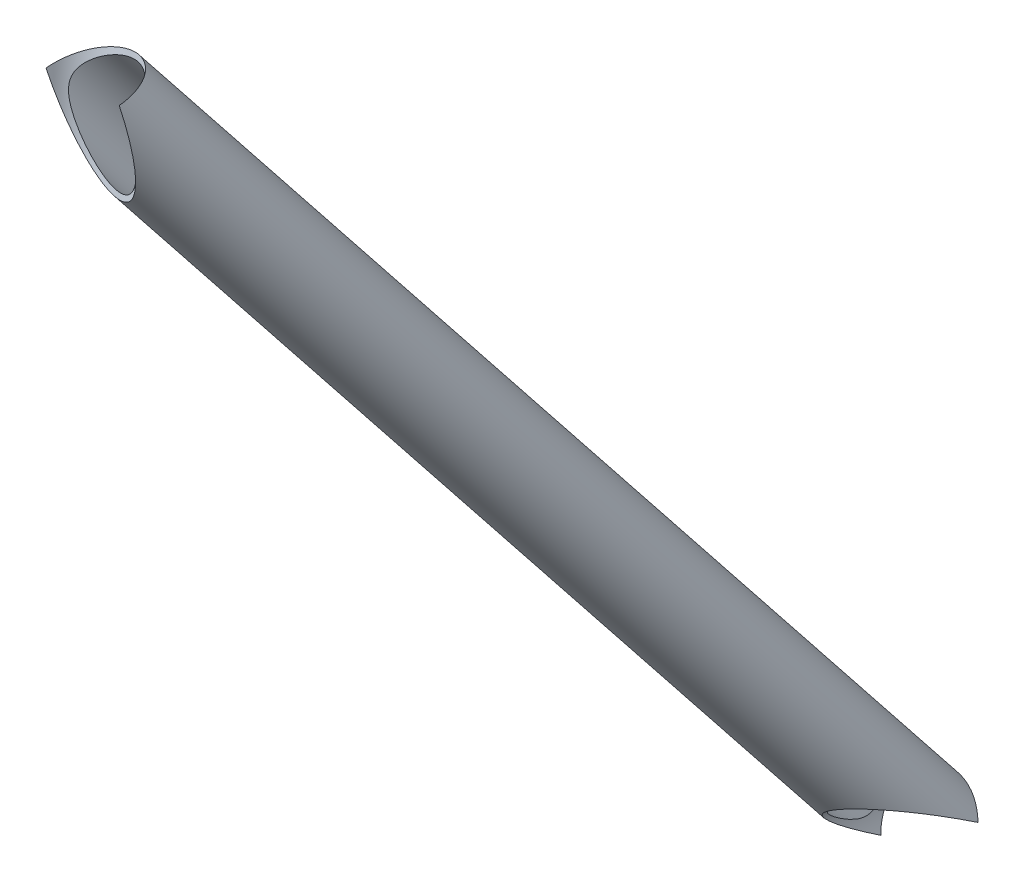
ISO-10303-21;
HEADER;
FILE_DESCRIPTION(('STEP AP214'),'2;1');
FILE_NAME('part.step','',(''),(''),'','','');
FILE_SCHEMA(('AUTOMOTIVE_DESIGN { 1 0 10303 214 1 1 1 1 }'));
ENDSEC;
DATA;
#1=APPLICATION_CONTEXT('core data for automotive mechanical design processes');
#2=APPLICATION_PROTOCOL_DEFINITION('international standard','automotive_design',2000,#1);
#3=PRODUCT_CONTEXT('',#1,'mechanical');
#4=PRODUCT('Part','Part','',(#3));
#5=PRODUCT_RELATED_PRODUCT_CATEGORY('part','',(#4));
#6=PRODUCT_DEFINITION_FORMATION('','',#4);
#7=PRODUCT_DEFINITION_CONTEXT('part definition',#1,'design');
#8=PRODUCT_DEFINITION('design','',#6,#7);
#9=PRODUCT_DEFINITION_SHAPE('','',#8);
#10=(LENGTH_UNIT() NAMED_UNIT(*) SI_UNIT(.MILLI.,.METRE.));
#11=(NAMED_UNIT(*) PLANE_ANGLE_UNIT() SI_UNIT($,.RADIAN.));
#12=(NAMED_UNIT(*) SI_UNIT($,.STERADIAN.) SOLID_ANGLE_UNIT());
#13=UNCERTAINTY_MEASURE_WITH_UNIT(LENGTH_MEASURE(1.E-05),#10,'distance_accuracy_value','');
#14=(GEOMETRIC_REPRESENTATION_CONTEXT(3) GLOBAL_UNCERTAINTY_ASSIGNED_CONTEXT((#13)) GLOBAL_UNIT_ASSIGNED_CONTEXT((#10,
#11,#12)) REPRESENTATION_CONTEXT('',''));
#15=CARTESIAN_POINT('',(0.,0.,0.));
#16=DIRECTION('',(0.,0.,1.));
#17=DIRECTION('',(1.,0.,0.));
#18=AXIS2_PLACEMENT_3D('',#15,#16,#17);
#19=CARTESIAN_POINT('',(250.,220.,-2000.));
#20=DIRECTION('',(-0.220873286514699,0.785327240941153,0.578339101168122));
#21=DIRECTION('',(0.,-0.59298432397081,0.805214003557365));
#22=AXIS2_PLACEMENT_3D('',#19,#20,#21);
#23=CYLINDRICAL_SURFACE('',#22,11.3);
#24=CARTESIAN_POINT('',(188.114990230466,433.334867430807,-1828.86011478433));
#25=CARTESIAN_POINT('',(188.266158284999,433.362322834038,-1828.83989705443));
#26=CARTESIAN_POINT('',(188.415986519138,433.396673524343,-1828.81856938916));
#27=CARTESIAN_POINT('',(188.711693017752,433.478751011434,-1828.77389875648));
#28=CARTESIAN_POINT('',(188.857568542377,433.526486838636,-1828.7505544359));
#29=CARTESIAN_POINT('',(189.144613552529,433.6346880259,-1828.70204815172));
#30=CARTESIAN_POINT('',(189.285770834581,433.695183820761,-1828.67688193856));
#31=CARTESIAN_POINT('',(189.562234221187,433.827810863912,-1828.62505215387));
#32=CARTESIAN_POINT('',(189.697538752933,433.899945215495,-1828.59838818422));
#33=CARTESIAN_POINT('',(189.993469256867,434.07325312663,-1828.5372899054));
#34=CARTESIAN_POINT('',(190.15238200611,434.177241604263,-1828.5025261569));
#35=CARTESIAN_POINT('',(190.459903592466,434.398996733595,-1828.43160413926));
#36=CARTESIAN_POINT('',(190.608509236657,434.516767624699,-1828.39544544334));
#37=CARTESIAN_POINT('',(191.039118766752,434.887704602835,-1828.28543394651));
#38=CARTESIAN_POINT('',(191.305769174728,435.158405670555,-1828.21007661456));
#39=CARTESIAN_POINT('',(191.753085611262,435.676387141786,-1828.07260753032));
#40=CARTESIAN_POINT('',(191.9404279892,435.918171229451,-1828.01073332015));
#41=CARTESIAN_POINT('',(192.293049719159,436.417476584247,-1827.88676270425));
#42=CARTESIAN_POINT('',(192.458314239333,436.675008262935,-1827.82466617762));
#43=CARTESIAN_POINT('',(192.769338491408,437.202095083379,-1827.7007523574));
#44=CARTESIAN_POINT('',(192.915066801935,437.471668686315,-1827.63893566456));
#45=CARTESIAN_POINT('',(193.189084500118,438.019767677615,-1827.51601798561));
#46=CARTESIAN_POINT('',(193.317367226983,438.29829643519,-1827.45491728096));
#47=CARTESIAN_POINT('',(193.557609913149,438.860304048931,-1827.33412122416));
#48=CARTESIAN_POINT('',(193.669671722041,439.143738274181,-1827.27441927024));
#49=CARTESIAN_POINT('',(193.880100711088,439.715819017629,-1827.15621886159));
#50=CARTESIAN_POINT('',(193.978469641741,440.004464864234,-1827.09772025384));
#51=CARTESIAN_POINT('',(194.163002151362,440.586197247886,-1826.98203610973));
#52=CARTESIAN_POINT('',(194.249153480119,440.879287920302,-1826.92485193877));
#53=CARTESIAN_POINT('',(194.410300784775,441.468805908798,-1826.81202163234));
#54=CARTESIAN_POINT('',(194.485296461398,441.765233314164,-1826.75637553815));
#55=CARTESIAN_POINT('',(194.625359135797,442.361840265714,-1826.6465994375));
#56=CARTESIAN_POINT('',(194.690389860291,442.662029409063,-1826.59247552929));
#57=CARTESIAN_POINT('',(194.811044072504,443.264646612775,-1826.4861372898));
#58=CARTESIAN_POINT('',(194.866666765471,443.567074860038,-1826.43392312013));
#59=CARTESIAN_POINT('',(194.969176491384,444.173565384906,-1826.33166123565));
#60=CARTESIAN_POINT('',(195.016068997837,444.477626514872,-1826.2816121786));
#61=CARTESIAN_POINT('',(195.101764918753,445.087271216278,-1826.18390663451));
#62=CARTESIAN_POINT('',(195.140568137605,445.392854824351,-1826.13625020535));
#63=CARTESIAN_POINT('',(195.215927234925,446.051896779727,-1826.03660165069));
#64=CARTESIAN_POINT('',(195.251242630084,446.405564254795,-1825.98505327307));
#65=CARTESIAN_POINT('',(195.312475938377,447.114303750611,-1825.8861660279));
#66=CARTESIAN_POINT('',(195.338393592493,447.469375809799,-1825.83882727639));
#67=CARTESIAN_POINT('',(195.381389079718,448.181039510916,-1825.749118066));
#68=CARTESIAN_POINT('',(195.398458143116,448.537632308572,-1825.70675256808));
#69=CARTESIAN_POINT('',(195.424145491876,449.251781900443,-1825.6281157396));
#70=CARTESIAN_POINT('',(195.432764128585,449.609338653959,-1825.59184415572));
#71=CARTESIAN_POINT('',(195.441846814269,450.323623105991,-1825.52699381989));
#72=CARTESIAN_POINT('',(195.442347733199,450.680347190883,-1825.49838086659));
#73=CARTESIAN_POINT('',(195.43547510621,451.394436401975,-1825.45060933891));
#74=CARTESIAN_POINT('',(195.428100199625,451.751801628292,-1825.43145239902));
#75=CARTESIAN_POINT('',(195.405517018541,452.466179362384,-1825.40542516541));
#76=CARTESIAN_POINT('',(195.390321453177,452.823191503723,-1825.39853501803));
#77=CARTESIAN_POINT('',(195.351909310781,453.536675960561,-1825.40096319875));
#78=CARTESIAN_POINT('',(195.32869643439,453.89314844904,-1825.41027405677));
#79=CARTESIAN_POINT('',(195.28448489296,454.4644675386,-1825.44294977454));
#80=CARTESIAN_POINT('',(195.26620107413,454.679917800347,-1825.45935359124));
#81=CARTESIAN_POINT('',(195.226225123174,455.109583716933,-1825.50205225222));
#82=CARTESIAN_POINT('',(195.20453256092,455.323799212424,-1825.52834834531));
#83=CARTESIAN_POINT('',(195.157441392468,455.749777032377,-1825.59287915041));
#84=CARTESIAN_POINT('',(195.132047479934,455.961542102458,-1825.63109881117));
#85=CARTESIAN_POINT('',(195.077077751804,456.381446524305,-1825.72190962621));
#86=CARTESIAN_POINT('',(195.047503065258,456.589586837974,-1825.77449690396));
#87=CARTESIAN_POINT('',(194.990621307435,456.954864848802,-1825.88310963191));
#88=CARTESIAN_POINT('',(194.964252041835,457.113129219616,-1825.93582043977));
#89=CARTESIAN_POINT('',(194.908274746722,457.424816082627,-1826.05257024331));
#90=CARTESIAN_POINT('',(194.878667834206,457.578240221327,-1826.11660533676));
#91=CARTESIAN_POINT('',(194.815907163116,457.878456241261,-1826.25662023072));
#92=CARTESIAN_POINT('',(194.782760196507,458.025260080737,-1826.33257728473));
#93=CARTESIAN_POINT('',(194.712522265025,458.310906844695,-1826.49669351038));
#94=CARTESIAN_POINT('',(194.675431470302,458.449750112224,-1826.58485215566));
#95=CARTESIAN_POINT('',(194.596817019195,458.718624269109,-1826.77326537604));
#96=CARTESIAN_POINT('',(194.555274166512,458.848612692389,-1826.87357259629));
#97=CARTESIAN_POINT('',(194.467643403193,459.098046687753,-1827.08473803392));
#98=CARTESIAN_POINT('',(194.42155537166,459.217491979238,-1827.19559653196));
#99=CARTESIAN_POINT('',(194.324557134398,459.44560809415,-1827.42638293693));
#100=CARTESIAN_POINT('',(194.273637726451,459.554257515566,-1827.54632805973));
#101=CARTESIAN_POINT('',(194.166911322907,459.760668123867,-1827.79323127348));
#102=CARTESIAN_POINT('',(194.11110263509,459.858425514124,-1827.92019178686));
#103=CARTESIAN_POINT('',(193.97342185674,460.077041268105,-1828.22611246708));
#104=CARTESIAN_POINT('',(193.889421236221,460.193474861269,-1828.40727850725));
#105=CARTESIAN_POINT('',(193.712015323914,460.409128464078,-1828.77514597155));
#106=CARTESIAN_POINT('',(193.618606142923,460.508341308674,-1828.9618496621));
#107=CARTESIAN_POINT('',(193.422065648801,460.691921095197,-1829.33801820676));
#108=CARTESIAN_POINT('',(193.318912643345,460.776253653889,-1829.52748838811));
#109=CARTESIAN_POINT('',(193.103018232593,460.93176820562,-1829.90630174689));
#110=CARTESIAN_POINT('',(192.990276892975,461.002950288724,-1830.09564492518));
#111=CARTESIAN_POINT('',(192.709677672984,461.159183113837,-1830.5451894194));
#112=CARTESIAN_POINT('',(192.537370037351,461.238946330062,-1830.80446642806));
#113=CARTESIAN_POINT('',(192.174373493335,461.379856796961,-1831.3151353866));
#114=CARTESIAN_POINT('',(191.983678889156,461.440998254559,-1831.56652486097));
#115=CARTESIAN_POINT('',(191.584371173578,461.547061832688,-1832.05810876223));
#116=CARTESIAN_POINT('',(191.3757640067,461.591989308491,-1832.29830686263));
#117=CARTESIAN_POINT('',(190.941181568746,461.667396570594,-1832.76485974217));
#118=CARTESIAN_POINT('',(190.715206259303,461.697876324979,-1832.99121449073));
#119=CARTESIAN_POINT('',(190.244949911946,461.745831707872,-1833.42929949903));
#120=CARTESIAN_POINT('',(190.000542916815,461.763206847728,-1833.64090567686));
#121=CARTESIAN_POINT('',(189.496071612413,461.785527187065,-1834.04530295655));
#122=CARTESIAN_POINT('',(189.236006900968,461.790472067131,-1834.23809357481));
#123=CARTESIAN_POINT('',(188.70169334667,461.78866896313,-1834.60270516275));
#124=CARTESIAN_POINT('',(188.427448179246,461.781923994359,-1834.77453152774));
#125=CARTESIAN_POINT('',(187.866388345266,461.757349205233,-1835.09536370855));
#126=CARTESIAN_POINT('',(187.579574051044,461.739519713028,-1835.24437019977));
#127=CARTESIAN_POINT('',(187.000636737213,461.693724218641,-1835.51539448523));
#128=CARTESIAN_POINT('',(186.708705924193,461.66594900609,-1835.637854915));
#129=CARTESIAN_POINT('',(186.116639219319,461.600685490554,-1835.85783442048));
#130=CARTESIAN_POINT('',(185.816503374707,461.563197243482,-1835.95535363977));
#131=CARTESIAN_POINT('',(185.21031655882,461.478967580402,-1836.12439057777));
#132=CARTESIAN_POINT('',(184.904266548333,461.432227656162,-1836.19591248309));
#133=CARTESIAN_POINT('',(184.288587866439,461.329943625276,-1836.31225270849));
#134=CARTESIAN_POINT('',(183.978959323079,461.274399832751,-1836.35707198104));
#135=CARTESIAN_POINT('',(183.373377295727,461.157808298382,-1836.41814638006));
#136=CARTESIAN_POINT('',(183.077475156915,461.097148894405,-1836.43566073774));
#137=CARTESIAN_POINT('',(182.486811455092,460.968637901126,-1836.44611645613));
#138=CARTESIAN_POINT('',(182.192049850856,460.900786574342,-1836.43905871346));
#139=CARTESIAN_POINT('',(181.605825709364,460.758259008751,-1836.40064103755));
#140=CARTESIAN_POINT('',(181.314362755157,460.683583643581,-1836.36928421133));
#141=CARTESIAN_POINT('',(180.736755440816,460.52771597925,-1836.28281484491));
#142=CARTESIAN_POINT('',(180.450611155088,460.446523589004,-1836.22770197266));
#143=CARTESIAN_POINT('',(179.884895143419,460.277656882512,-1836.09434668027));
#144=CARTESIAN_POINT('',(179.605342014266,460.189966583362,-1836.01604570615));
#145=CARTESIAN_POINT('',(179.055437287265,460.008438460939,-1835.83739893503));
#146=CARTESIAN_POINT('',(178.785085713255,459.914600621741,-1835.73705308093));
#147=CARTESIAN_POINT('',(178.255209491267,459.720743688,-1835.51549998832));
#148=CARTESIAN_POINT('',(177.995690118517,459.620721639276,-1835.39428272948));
#149=CARTESIAN_POINT('',(177.489264940146,459.414362939616,-1835.13244890991));
#150=CARTESIAN_POINT('',(177.242359250403,459.308026230687,-1834.99183217101));
#151=CARTESIAN_POINT('',(176.750629136173,459.083079901261,-1834.68526746818));
#152=CARTESIAN_POINT('',(176.506536925475,458.964121830321,-1834.51839994241));
#153=CARTESIAN_POINT('',(176.035735752198,458.717859889124,-1834.16712359656));
#154=CARTESIAN_POINT('',(175.809029647292,458.590554653233,-1833.98271190395));
#155=CARTESIAN_POINT('',(175.374892871281,458.326179911002,-1833.59885129276));
#156=CARTESIAN_POINT('',(175.167460569904,458.189111232238,-1833.39940364859));
#157=CARTESIAN_POINT('',(174.773915054476,457.903041746472,-1832.98846683685));
#158=CARTESIAN_POINT('',(174.587793555652,457.754045614919,-1832.7769823969));
#159=CARTESIAN_POINT('',(174.297106392204,457.492908272462,-1832.41741313209));
#160=CARTESIAN_POINT('',(174.185972237694,457.384943821361,-1832.27157744693));
#161=CARTESIAN_POINT('',(173.975162394976,457.161033440583,-1831.97778293104));
#162=CARTESIAN_POINT('',(173.875483864186,457.04508950239,-1831.8298246373));
#163=CARTESIAN_POINT('',(173.688750225235,456.804007896725,-1831.53392601357));
#164=CARTESIAN_POINT('',(173.60167303345,456.678886906448,-1831.38598611748));
#165=CARTESIAN_POINT('',(173.441111957166,456.417776472567,-1831.09230945069));
#166=CARTESIAN_POINT('',(173.36762410113,456.28179022107,-1830.94657204777));
#167=CARTESIAN_POINT('',(173.250614275635,456.03021192289,-1830.69316627042));
#168=CARTESIAN_POINT('',(173.204084994242,455.917093272251,-1830.58443120755));
#169=CARTESIAN_POINT('',(173.120333503569,455.683238119213,-1830.37169397944));
#170=CARTESIAN_POINT('',(173.083108430309,455.562503975347,-1830.26769036588));
#171=CARTESIAN_POINT('',(173.018367909365,455.313540484506,-1830.06622164493));
#172=CARTESIAN_POINT('',(172.990836744434,455.185323666821,-1829.96874616292));
#173=CARTESIAN_POINT('',(172.945506657853,454.92160257378,-1829.78169331698));
#174=CARTESIAN_POINT('',(172.927707573112,454.786098420589,-1829.69211582071));
#175=CARTESIAN_POINT('',(172.901596626622,454.508444608958,-1829.52193693061));
#176=CARTESIAN_POINT('',(172.893297428487,454.366286342381,-1829.44134764709));
#177=CARTESIAN_POINT('',(172.885659771807,454.076644452139,-1829.28993870416));
#178=CARTESIAN_POINT('',(172.886321556161,453.929160684228,-1829.21911930962));
#179=CARTESIAN_POINT('',(172.895785309204,453.629958139534,-1829.08723509074));
#180=CARTESIAN_POINT('',(172.904597407081,453.478234320821,-1829.02618251534));
#181=CARTESIAN_POINT('',(172.929425889748,453.171888163838,-1828.91348067518));
#182=CARTESIAN_POINT('',(172.945445105629,453.017264709433,-1828.86183511689));
#183=CARTESIAN_POINT('',(172.996454740273,452.602742636243,-1828.73574023501));
#184=CARTESIAN_POINT('',(173.036977515484,452.341188371332,-1828.66895346899));
#185=CARTESIAN_POINT('',(173.131483083872,451.816247680865,-1828.55500418511));
#186=CARTESIAN_POINT('',(173.185477198352,451.552859896327,-1828.50785826281));
#187=CARTESIAN_POINT('',(173.30436600721,451.024914594114,-1828.42881652027));
#188=CARTESIAN_POINT('',(173.369314484157,450.760357902433,-1828.39699908491));
#189=CARTESIAN_POINT('',(173.507898346483,450.232504348887,-1828.3454614552));
#190=CARTESIAN_POINT('',(173.581530873362,449.969207101986,-1828.32573729331));
#191=CARTESIAN_POINT('',(173.721225641061,449.495003759212,-1828.29854257329));
#192=CARTESIAN_POINT('',(173.786001687622,449.283804411977,-1828.2894407705));
#193=CARTESIAN_POINT('',(173.919882130234,448.862617947937,-1828.27620807517));
#194=CARTESIAN_POINT('',(173.988986852625,448.652630923837,-1828.27207755789));
#195=CARTESIAN_POINT('',(174.202302278278,448.024465840395,-1828.26573208623));
#196=CARTESIAN_POINT('',(174.352467277255,447.608241370618,-1828.26957078174));
#197=CARTESIAN_POINT('',(174.667276557887,446.780702526897,-1828.28807061769));
#198=CARTESIAN_POINT('',(174.831948480906,446.369399299877,-1828.30275283));
#199=CARTESIAN_POINT('',(175.174812754282,445.552912808474,-1828.33943664006));
#200=CARTESIAN_POINT('',(175.353002181179,445.147728243394,-1828.36143665864));
#201=CARTESIAN_POINT('',(175.722592537573,444.344284797649,-1828.41023367935));
#202=CARTESIAN_POINT('',(175.91397838369,443.946018640644,-1828.43702525884));
#203=CARTESIAN_POINT('',(176.310430595382,443.156517544595,-1828.49359381192));
#204=CARTESIAN_POINT('',(176.515498212198,442.765283252801,-1828.52337105868));
#205=CARTESIAN_POINT('',(176.939581148507,441.991293359648,-1828.58442926546));
#206=CARTESIAN_POINT('',(177.158575961755,441.608526362096,-1828.6157079988));
#207=CARTESIAN_POINT('',(177.611624914745,440.852092267946,-1828.6786081438));
#208=CARTESIAN_POINT('',(177.845676492084,440.478423637804,-1828.71022949639));
#209=CARTESIAN_POINT('',(178.270556260892,439.832194581035,-1828.76505912205));
#210=CARTESIAN_POINT('',(178.457881091407,439.55734279183,-1828.78842615028));
#211=CARTESIAN_POINT('',(178.842447785022,439.014538868945,-1828.83428861738));
#212=CARTESIAN_POINT('',(179.039690398726,438.746587259818,-1828.85678399006));
#213=CARTESIAN_POINT('',(179.444901886538,438.21862971495,-1828.90043526802));
#214=CARTESIAN_POINT('',(179.652874619752,437.95862669223,-1828.9215906852));
#215=CARTESIAN_POINT('',(180.080355576926,437.448119196681,-1828.96203688938));
#216=CARTESIAN_POINT('',(180.299863204853,437.197614234214,-1828.98132777257));
#217=CARTESIAN_POINT('',(180.753355362192,436.705891149106,-1829.01761381753));
#218=CARTESIAN_POINT('',(180.987446542275,436.464769379719,-1829.03458820444));
#219=CARTESIAN_POINT('',(181.469653531959,435.996555214114,-1829.06534280254));
#220=CARTESIAN_POINT('',(181.717772772758,435.76946627894,-1829.07912222802));
#221=CARTESIAN_POINT('',(182.228713887622,435.333245760901,-1829.10259577306));
#222=CARTESIAN_POINT('',(182.491503511318,435.124077166147,-1829.11229848275));
#223=CARTESIAN_POINT('',(183.03328161212,434.727892501886,-1829.12659366603));
#224=CARTESIAN_POINT('',(183.312258242251,434.540860528293,-1829.13118982857));
#225=CARTESIAN_POINT('',(183.914575699916,434.178572410534,-1829.13411644761));
#226=CARTESIAN_POINT('',(184.239618255129,434.006095698016,-1829.13181429918));
#227=CARTESIAN_POINT('',(184.910356775301,433.705585244265,-1829.11745330933));
#228=CARTESIAN_POINT('',(185.256060948376,433.577569305106,-1829.10539056618));
#229=CARTESIAN_POINT('',(185.78911106422,433.428490731631,-1829.07823334971));
#230=CARTESIAN_POINT('',(185.970723103443,433.38579132043,-1829.06754746097));
#231=CARTESIAN_POINT('',(186.336837669006,433.317249424532,-1829.04287557974));
#232=CARTESIAN_POINT('',(186.521338242495,433.291396015363,-1829.02889173397));
#233=CARTESIAN_POINT('',(186.891064352516,433.258194049063,-1828.99752904089));
#234=CARTESIAN_POINT('',(187.076284979558,433.250780029201,-1828.98016244042));
#235=CARTESIAN_POINT('',(187.446023457067,433.255432268078,-1828.9419898872));
#236=CARTESIAN_POINT('',(187.630541840688,433.267478115191,-1828.92118755876));
#237=CARTESIAN_POINT('',(187.864043678047,433.29551337458,-1828.89255350424));
#238=CARTESIAN_POINT('',(187.914414234576,433.302330240469,-1828.88623775909));
#239=CARTESIAN_POINT('',(188.014902086909,433.317469310088,-1828.87336004604));
#240=CARTESIAN_POINT('',(188.065019361933,433.325791635331,-1828.86679805829));
#241=CARTESIAN_POINT('',(188.114990230466,433.334867430807,-1828.86011478433));
#242=B_SPLINE_CURVE_WITH_KNOTS('',3,(#24,#25,#26,#27,#28,#29,#30,#31,#32,#33,#34,#35,#36,#37,
#38,#39,#40,#41,#42,#43,#44,#45,#46,#47,#48,#49,#50,#51,#52,#53,#54,#55,#56,#57,#58,#59,#60,#61,
#62,#63,#64,#65,#66,#67,#68,#69,#70,#71,#72,#73,#74,#75,#76,#77,#78,#79,#80,#81,#82,#83,#84,#85,
#86,#87,#88,#89,#90,#91,#92,#93,#94,#95,#96,#97,#98,#99,#100,#101,#102,#103,#104,#105,#106,#107,
#108,#109,#110,#111,#112,#113,#114,#115,#116,#117,#118,#119,#120,#121,#122,#123,#124,#125,#126,
#127,#128,#129,#130,#131,#132,#133,#134,#135,#136,#137,#138,#139,#140,#141,#142,#143,#144,#145,
#146,#147,#148,#149,#150,#151,#152,#153,#154,#155,#156,#157,#158,#159,#160,#161,#162,#163,#164,
#165,#166,#167,#168,#169,#170,#171,#172,#173,#174,#175,#176,#177,#178,#179,#180,#181,#182,#183,
#184,#185,#186,#187,#188,#189,#190,#191,#192,#193,#194,#195,#196,#197,#198,#199,#200,#201,#202,
#203,#204,#205,#206,#207,#208,#209,#210,#211,#212,#213,#214,#215,#216,#217,#218,#219,#220,#221,
#222,#223,#224,#225,#226,#227,#228,#229,#230,#231,#232,#233,#234,#235,#236,#237,#238,#239,#240,
#241),.UNSPECIFIED.,.T.,.F.,(4,2,2,2,2,2,2,2,2,2,2,2,2,2,2,2,2,2,2,2,2,2,2,2,2,2,2,2,2,2,2,2,2,
2,2,2,2,2,2,2,2,2,2,2,2,2,2,2,2,2,2,2,2,2,2,2,2,2,2,2,2,2,2,2,2,2,2,2,2,2,2,2,2,2,2,2,2,2,2,2,2,
2,2,2,2,2,2,2,2,2,2,2,2,2,2,2,2,2,2,2,2,2,2,2,2,2,2,2,4),(0.,0.464838716407554,0.92999179852184,
1.39626716033827,1.8626670554579,2.44096557494113,3.01944244615623,4.1769116116674,
5.11194617277286,6.04760576224579,6.98475262788908,7.92225630121754,8.85359120292347,
9.78480693315725,10.7169498611369,11.6491177915336,12.5846021656952,13.5201655262056,
14.4551403326004,15.3901377453428,16.4674130147209,17.5447179733912,18.623088602125,
19.7014143931565,20.7748411442187,21.8484533755473,22.9203263926815,23.9917053128579,
24.6420439646171,25.2924647442961,25.9420677909289,26.5914957411475,27.0977316880496,
27.603793529885,28.1089013124887,28.6139873119733,29.1213461380846,29.6287184631593,
30.1370773478594,30.645612880208,31.3379905995462,32.0306557099965,32.7249009493699,
33.419141433732,34.3819490131228,35.345055808874,36.3078442110195,37.270634739964,
38.240735097954,39.2108603839219,40.1807354715916,41.1505818481039,42.1027411163492,
43.0548949035335,44.0068952874556,44.9588617117652,45.8654703524082,46.7720459115935,
47.6785055701432,48.5849779000957,49.4937590377015,50.4025425295066,51.3117635499838,
52.2209929217121,53.1760521081255,54.1312679382156,55.0864028978371,56.0411652699189,
56.6791058749678,57.3168878390174,57.9535382028145,58.5900022079434,59.0805275122332,
59.5709016387479,60.0604769944177,60.5500441454782,61.0402631460478,61.5304954346684,
62.0213378024932,62.5123731510296,63.3298196693815,64.1479554970386,64.9702317303559,
65.7922380491475,66.4554190426243,67.1186500937386,68.4456053831699,69.7751461116807,
71.1044001127652,72.4321591992412,73.7600398802242,75.0860087485943,76.4117525536436,
77.4118718173485,78.4120668870968,79.4126242209924,80.4131299045914,81.4220893267085,
82.4312966123323,83.4383665797343,84.4447085669397,85.5460724047834,86.6478767211811,
87.207813874837,87.7673875522806,88.3249718011856,88.8819715746479,89.0356185796928,
89.1892779917851),.UNSPECIFIED.);
#243=CARTESIAN_POINT('',(188.114990230466,433.334867430807,-1828.86011478433));
#244=VERTEX_POINT('',#243);
#245=EDGE_CURVE('E89',#244,#244,#242,.T.);
#246=ORIENTED_EDGE('',*,*,#245,.T.);
#247=EDGE_LOOP('',(#246));
#248=FACE_BOUND('',#247,.T.);
#249=CARTESIAN_POINT('',(244.368451151481,233.322561933863,-1976.15531983164));
#250=CARTESIAN_POINT('',(244.214024202033,233.121345585131,-1976.3034997592));
#251=CARTESIAN_POINT('',(244.065883954102,232.920329121067,-1976.45849957673));
#252=CARTESIAN_POINT('',(243.780746964738,232.519324317622,-1976.77975450985));
#253=CARTESIAN_POINT('',(243.64375414678,232.31933636324,-1976.94601355086));
#254=CARTESIAN_POINT('',(243.379562296036,231.920589773084,-1977.28816015794));
#255=CARTESIAN_POINT('',(243.252376612181,231.721833140095,-1977.46406030898));
#256=CARTESIAN_POINT('',(243.006966584441,231.326113120433,-1977.82385748835));
#257=CARTESIAN_POINT('',(242.88874127372,231.12914954231,-1978.00775365053));
#258=CARTESIAN_POINT('',(242.659654229308,230.735999627893,-1978.38359216557));
#259=CARTESIAN_POINT('',(242.548840838862,230.539825012021,-1978.57557611257));
#260=CARTESIAN_POINT('',(242.334565448239,230.149564512395,-1978.96569715965));
#261=CARTESIAN_POINT('',(242.231104157867,229.955478831847,-1979.16383485121));
#262=CARTESIAN_POINT('',(242.030945655939,229.569666155444,-1979.56540320635));
#263=CARTESIAN_POINT('',(241.934243329597,229.377937468526,-1979.76882970417));
#264=CARTESIAN_POINT('',(241.746928452845,228.996774158878,-1980.18058236568));
#265=CARTESIAN_POINT('',(241.656316170404,228.807339637393,-1980.38890874442));
#266=CARTESIAN_POINT('',(241.437443545665,228.338219383285,-1980.91363888763));
#267=CARTESIAN_POINT('',(241.312599387681,228.059994774229,-1981.23277889277));
#268=CARTESIAN_POINT('',(241.073830473854,227.5091971354,-1981.87990918682));
#269=CARTESIAN_POINT('',(240.959906546304,227.236624535555,-1982.20790014466));
#270=CARTESIAN_POINT('',(240.741617574806,226.697379717245,-1982.87226322795));
#271=CARTESIAN_POINT('',(240.637260110055,226.430712301969,-1983.20864173476));
#272=CARTESIAN_POINT('',(240.437047051826,225.904126868212,-1983.88909305875));
#273=CARTESIAN_POINT('',(240.341191117297,225.644208579276,-1984.23316556658));
#274=CARTESIAN_POINT('',(240.157190409108,225.132858205544,-1984.92768168085));
#275=CARTESIAN_POINT('',(240.069020370047,224.881400124348,-1985.27809945591));
#276=CARTESIAN_POINT('',(239.898924615111,224.38726259226,-1985.98661173083));
#277=CARTESIAN_POINT('',(239.816999420419,224.144583874963,-1986.34470686824));
#278=CARTESIAN_POINT('',(239.658305918911,223.670083438481,-1987.0686647337));
#279=CARTESIAN_POINT('',(239.581532931516,223.438251924651,-1987.43452000308));
#280=CARTESIAN_POINT('',(239.431752270536,222.987982802894,-1988.17509049516));
#281=CARTESIAN_POINT('',(239.35874379748,222.769542349229,-1988.54980381181));
#282=CARTESIAN_POINT('',(239.237941339214,222.417547265123,-1989.18772510106));
#283=CARTESIAN_POINT('',(239.18956443287,222.279222109178,-1989.44818660665));
#284=CARTESIAN_POINT('',(239.093207102522,222.012769459538,-1989.9744366244));
#285=CARTESIAN_POINT('',(239.045226738573,221.884643486046,-1990.24022592331));
#286=CARTESIAN_POINT('',(238.949024564806,221.641453867451,-1990.77764219038));
#287=CARTESIAN_POINT('',(238.900802813112,221.526387222137,-1991.04926780059));
#288=CARTESIAN_POINT('',(238.803417517198,221.313258415211,-1991.59896673801));
#289=CARTESIAN_POINT('',(238.754254320573,221.215190107035,-1991.87703769318));
#290=CARTESIAN_POINT('',(238.670848874369,221.070172460216,-1992.34719155726));
#291=CARTESIAN_POINT('',(238.637025767401,221.017025126011,-1992.53742879064));
#292=CARTESIAN_POINT('',(238.568623370466,220.922996379158,-1992.92075960745));
#293=CARTESIAN_POINT('',(238.534044342164,220.882110791974,-1993.11385219523));
#294=CARTESIAN_POINT('',(238.464290326897,220.81506577532,-1993.50204206747));
#295=CARTESIAN_POINT('',(238.4291169343,220.788871909552,-1993.69713356339));
#296=CARTESIAN_POINT('',(238.358457715499,220.753576357257,-1994.08882206593));
#297=CARTESIAN_POINT('',(238.322971985461,220.744469582741,-1994.28541860689));
#298=CARTESIAN_POINT('',(238.258544824617,220.745428434414,-1994.64451941551));
#299=CARTESIAN_POINT('',(238.229536475301,220.752440903738,-1994.80701881873));
#300=CARTESIAN_POINT('',(238.172432099593,220.780425894262,-1995.13096187749));
#301=CARTESIAN_POINT('',(238.144335877446,220.801395399042,-1995.29240575354));
#302=CARTESIAN_POINT('',(238.089827370567,220.857517348092,-1995.61306919849));
#303=CARTESIAN_POINT('',(238.063414772866,220.892667147422,-1995.77228917647));
#304=CARTESIAN_POINT('',(238.01311504805,220.97671885623,-1996.08746542257));
#305=CARTESIAN_POINT('',(237.989228074447,221.025621600973,-1996.24342149185));
#306=CARTESIAN_POINT('',(237.944926820248,221.135884382751,-1996.55043521523));
#307=CARTESIAN_POINT('',(237.924495449948,221.197179614553,-1996.7015137951));
#308=CARTESIAN_POINT('',(237.887685799529,221.331008021658,-1996.9990910311));
#309=CARTESIAN_POINT('',(237.871307542084,221.403541259826,-1997.1455896616));
#310=CARTESIAN_POINT('',(237.843182722707,221.558442371096,-1997.43403425858));
#311=CARTESIAN_POINT('',(237.831443680574,221.640825931582,-1997.57597249374));
#312=CARTESIAN_POINT('',(237.813101065403,221.81382892465,-1997.85509933734));
#313=CARTESIAN_POINT('',(237.806498954913,221.904450694557,-1997.9922865825));
#314=CARTESIAN_POINT('',(237.796318437641,222.153177242656,-1998.3491043426));
#315=CARTESIAN_POINT('',(237.797437529481,222.317105212399,-1998.56483280068));
#316=CARTESIAN_POINT('',(237.81566485896,222.658057053191,-1998.98500299499));
#317=CARTESIAN_POINT('',(237.832782074663,222.835088226317,-1999.18943832535));
#318=CARTESIAN_POINT('',(237.883676827998,223.198265035836,-1999.58837036921));
#319=CARTESIAN_POINT('',(237.917478089,223.384423309754,-1999.78285249418));
#320=CARTESIAN_POINT('',(238.002112806706,223.762259600741,-2000.16242109909));
#321=CARTESIAN_POINT('',(238.052943523786,223.95393672543,-2000.34750908479));
#322=CARTESIAN_POINT('',(238.174142361024,224.347685569685,-2000.71597855642));
#323=CARTESIAN_POINT('',(238.245194073338,224.549871444698,-2000.89901306058));
#324=CARTESIAN_POINT('',(238.405941400987,224.9548368739,-2001.25601628487));
#325=CARTESIAN_POINT('',(238.495637628712,225.157616447372,-2001.42998470699));
#326=CARTESIAN_POINT('',(238.693539576208,225.561511461662,-2001.76888160727));
#327=CARTESIAN_POINT('',(238.80173657111,225.762627640272,-2001.93381429844));
#328=CARTESIAN_POINT('',(239.036440145432,226.161370876073,-2002.25462577142));
#329=CARTESIAN_POINT('',(239.162947282206,226.358997826847,-2002.41050427742));
#330=CARTESIAN_POINT('',(239.453920122034,226.777814379141,-2002.73528317323));
#331=CARTESIAN_POINT('',(239.621232438099,226.998177346425,-2002.90271058341));
#332=CARTESIAN_POINT('',(239.978713813244,227.429588097212,-2003.2247306539));
#333=CARTESIAN_POINT('',(240.168885105584,227.640634967799,-2003.37932205767));
#334=CARTESIAN_POINT('',(240.571063702653,228.051230373109,-2003.67498539621));
#335=CARTESIAN_POINT('',(240.783076881383,228.250775792096,-2003.81605367435));
#336=CARTESIAN_POINT('',(241.227543544366,228.636262133742,-2004.08383067048));
#337=CARTESIAN_POINT('',(241.459995972108,228.822203758677,-2004.21054012989));
#338=CARTESIAN_POINT('',(241.936762273272,229.17353254399,-2004.44536957589));
#339=CARTESIAN_POINT('',(242.180541914425,229.339357374282,-2004.55391975969));
#340=CARTESIAN_POINT('',(242.684156584782,229.655004917942,-2004.75600935915));
#341=CARTESIAN_POINT('',(242.943991413472,229.804827831096,-2004.84954896223));
#342=CARTESIAN_POINT('',(243.477762669623,230.087218016183,-2005.02093761221));
#343=CARTESIAN_POINT('',(243.751696611379,230.219788315346,-2005.09878941308));
#344=CARTESIAN_POINT('',(244.311636633347,230.466730185016,-2005.23822869612));
#345=CARTESIAN_POINT('',(244.597642544127,230.581102010834,-2005.29981640646));
#346=CARTESIAN_POINT('',(245.171962483634,230.788219803063,-2005.40483123426));
#347=CARTESIAN_POINT('',(245.46002332623,230.881450575917,-2005.44868875022));
#348=CARTESIAN_POINT('',(246.043409864575,231.04960138054,-2005.52008595136));
#349=CARTESIAN_POINT('',(246.338735407638,231.124521796788,-2005.54762597921));
#350=CARTESIAN_POINT('',(246.934448822283,231.255919608282,-2005.58604210151));
#351=CARTESIAN_POINT('',(247.234835495187,231.312401307741,-2005.59692208717));
#352=CARTESIAN_POINT('',(247.838605242134,231.407099530821,-2005.6017264864));
#353=CARTESIAN_POINT('',(248.141988365543,231.445315753014,-2005.59565062017));
#354=CARTESIAN_POINT('',(248.754541289947,231.504383217122,-2005.5660055347));
#355=CARTESIAN_POINT('',(249.063725448237,231.524944193498,-2005.54215551882));
#356=CARTESIAN_POINT('',(249.680824590027,231.548400850165,-2005.47628030899));
#357=CARTESIAN_POINT('',(249.988739541401,231.551296086006,-2005.43425465778));
#358=CARTESIAN_POINT('',(250.601651792398,231.540497494146,-2005.33147956655));
#359=CARTESIAN_POINT('',(250.906643477154,231.526776445196,-2005.27069952425));
#360=CARTESIAN_POINT('',(251.511035570841,231.484179297436,-2005.12978439124));
#361=CARTESIAN_POINT('',(251.810436132014,231.455303611896,-2005.04964982835));
#362=CARTESIAN_POINT('',(252.413576036923,231.382898985248,-2004.8653750852));
#363=CARTESIAN_POINT('',(252.716990812191,231.338818307848,-2004.76038610062));
#364=CARTESIAN_POINT('',(253.312844281163,231.23928533139,-2004.5268095913));
#365=CARTESIAN_POINT('',(253.605278874338,231.183828833052,-2004.39821335401));
#366=CARTESIAN_POINT('',(254.17520968292,231.065760416985,-2004.11565927722));
#367=CARTESIAN_POINT('',(254.452742221336,231.003167179053,-2003.96176720089));
#368=CARTESIAN_POINT('',(254.989623717537,230.876320040778,-2003.62569387665));
#369=CARTESIAN_POINT('',(255.248991005455,230.812067906704,-2003.44354176011));
#370=CARTESIAN_POINT('',(255.632226669096,230.717358836932,-2003.13771404061));
#371=CARTESIAN_POINT('',(255.764284150244,230.684769791623,-2003.02489290522));
#372=CARTESIAN_POINT('',(256.020361959364,230.622979283997,-2002.78964782793));
#373=CARTESIAN_POINT('',(256.144385494374,230.593776466222,-2002.66722776146));
#374=CARTESIAN_POINT('',(256.382977222991,230.540480997938,-2002.41303635706));
#375=CARTESIAN_POINT('',(256.497569126993,230.516375278155,-2002.28129012021));
#376=CARTESIAN_POINT('',(256.716509919745,230.474835138724,-2002.00852462181));
#377=CARTESIAN_POINT('',(256.820859048498,230.457400562734,-2001.86750557765));
#378=CARTESIAN_POINT('',(257.019094672544,230.430535964149,-2001.57594432443));
#379=CARTESIAN_POINT('',(257.112894262806,230.421168717159,-2001.4253370531));
#380=CARTESIAN_POINT('',(257.288465204408,230.411667914544,-2001.11699981809));
#381=CARTESIAN_POINT('',(257.370237056928,230.41153397407,-2000.95927015154));
#382=CARTESIAN_POINT('',(257.521746922363,230.420866016149,-2000.63824567978));
#383=CARTESIAN_POINT('',(257.591473435593,230.430341113818,-2000.47494573275));
#384=CARTESIAN_POINT('',(257.719280685423,230.458627579911,-2000.14465432575));
#385=CARTESIAN_POINT('',(257.77735931073,230.477440638787,-1999.97766220263));
#386=CARTESIAN_POINT('',(257.901820153678,230.532025210838,-1999.58071920938));
#387=CARTESIAN_POINT('',(257.963611611731,230.571468937544,-1999.34983622592));
#388=CARTESIAN_POINT('',(258.070121636307,230.663696801668,-1998.88682929872));
#389=CARTESIAN_POINT('',(258.114830836351,230.716488231563,-1998.65470474474));
#390=CARTESIAN_POINT('',(258.190204253201,230.832929278465,-1998.1899074572));
#391=CARTESIAN_POINT('',(258.220807993865,230.896624072918,-1997.95723658441));
#392=CARTESIAN_POINT('',(258.270183857212,231.032304771866,-1997.49318952532));
#393=CARTESIAN_POINT('',(258.288958633234,231.104288812725,-1997.26181306022));
#394=CARTESIAN_POINT('',(258.325232930153,231.300523668319,-1996.65957477501));
#395=CARTESIAN_POINT('',(258.334937591071,231.429826506104,-1996.28990450679));
#396=CARTESIAN_POINT('',(258.335016466057,231.698871851818,-1995.55429881192));
#397=CARTESIAN_POINT('',(258.325378116208,231.838621088262,-1995.18836596801));
#398=CARTESIAN_POINT('',(258.290489632232,232.124816320881,-1994.45900552993));
#399=CARTESIAN_POINT('',(258.265205599798,232.271276216822,-1994.09558511269));
#400=CARTESIAN_POINT('',(258.201438761169,232.567765037275,-1993.37151168389));
#401=CARTESIAN_POINT('',(258.162959260778,232.717793059129,-1993.01085800231));
#402=CARTESIAN_POINT('',(258.074139349948,233.02008201833,-1992.29013629039));
#403=CARTESIAN_POINT('',(258.023749034354,233.172349751534,-1991.93007732406));
#404=CARTESIAN_POINT('',(257.912141172547,233.476943683649,-1991.21165026378));
#405=CARTESIAN_POINT('',(257.85092302424,233.629269885342,-1990.85328226501));
#406=CARTESIAN_POINT('',(257.718277115493,233.932522442683,-1990.13842547713));
#407=CARTESIAN_POINT('',(257.646863001783,234.083450386806,-1989.7819348262));
#408=CARTESIAN_POINT('',(257.493984540894,234.383040916612,-1989.07016745127));
#409=CARTESIAN_POINT('',(257.412520439105,234.531703557507,-1988.71489069786));
#410=CARTESIAN_POINT('',(257.243963914803,234.818224303522,-1988.02370029501));
#411=CARTESIAN_POINT('',(257.157376685818,234.956244785545,-1987.68773083424));
#412=CARTESIAN_POINT('',(256.974934402911,235.228554279974,-1987.01679936653));
#413=CARTESIAN_POINT('',(256.8790795274,235.362843364149,-1986.68183734034));
#414=CARTESIAN_POINT('',(256.677653521226,235.626959806495,-1986.01271903082));
#415=CARTESIAN_POINT('',(256.5720743055,235.756783326454,-1985.67856365938));
#416=CARTESIAN_POINT('',(256.3507380631,236.010928205996,-1985.01152922777));
#417=CARTESIAN_POINT('',(256.234981218048,236.135249663706,-1984.67865014493));
#418=CARTESIAN_POINT('',(255.992788582278,236.377131852737,-1984.01505673658));
#419=CARTESIAN_POINT('',(255.866372163079,236.494704222105,-1983.68433961282));
#420=CARTESIAN_POINT('',(255.601751033011,236.722108445202,-1983.02490713952));
#421=CARTESIAN_POINT('',(255.463545335898,236.83193964993,-1982.69619195993));
#422=CARTESIAN_POINT('',(255.174350017816,237.04223008795,-1982.04185292655));
#423=CARTESIAN_POINT('',(255.023375264881,237.142699942442,-1981.71622595537));
#424=CARTESIAN_POINT('',(254.707076087596,237.332505022456,-1981.06877349679));
#425=CARTESIAN_POINT('',(254.541755292481,237.421843050237,-1980.74694707122));
#426=CARTESIAN_POINT('',(254.193003525422,237.587889845722,-1980.10502912189));
#427=CARTESIAN_POINT('',(254.009394333963,237.664449877387,-1979.78499502288));
#428=CARTESIAN_POINT('',(253.623147953591,237.800454766516,-1979.15244757446));
#429=CARTESIAN_POINT('',(253.420499572399,237.859889472233,-1978.83993878615));
#430=CARTESIAN_POINT('',(252.994887436401,237.956756616687,-1978.22839373092));
#431=CARTESIAN_POINT('',(252.772065470699,237.994330647434,-1977.92928261444));
#432=CARTESIAN_POINT('',(252.302291957335,238.04201959107,-1977.34861045313));
#433=CARTESIAN_POINT('',(252.055383436275,238.052182571181,-1977.06701953391));
#434=CARTESIAN_POINT('',(251.582605530057,238.038669350846,-1976.5795708441));
#435=CARTESIAN_POINT('',(251.361179553827,238.020856153793,-1976.36929392544));
#436=CARTESIAN_POINT('',(250.900092437518,237.956609334206,-1975.97376683867));
#437=CARTESIAN_POINT('',(250.660432151386,237.910177051237,-1975.7885154997));
#438=CARTESIAN_POINT('',(250.288073939466,237.815345489177,-1975.53591369276));
#439=CARTESIAN_POINT('',(250.160984097691,237.779234956119,-1975.45550900837));
#440=CARTESIAN_POINT('',(249.903611009975,237.698171762136,-1975.30497591606));
#441=CARTESIAN_POINT('',(249.773329459044,237.653223709079,-1975.23484218598));
#442=CARTESIAN_POINT('',(249.510641149953,237.554389151128,-1975.10613093398));
#443=CARTESIAN_POINT('',(249.378236774612,237.500512110214,-1975.04754131867));
#444=CARTESIAN_POINT('',(249.112369666897,237.383967942369,-1974.9428231266));
#445=CARTESIAN_POINT('',(248.97890705368,237.321301792192,-1974.89669316683));
#446=CARTESIAN_POINT('',(248.72578248795,237.194481308335,-1974.82152454729));
#447=CARTESIAN_POINT('',(248.60609340241,237.131122203799,-1974.79122713802));
#448=CARTESIAN_POINT('',(248.367842192852,236.998284294993,-1974.74130520391));
#449=CARTESIAN_POINT('',(248.249280449305,236.928803500615,-1974.72168416486));
#450=CARTESIAN_POINT('',(248.014151320662,236.784427907963,-1974.69295933661));
#451=CARTESIAN_POINT('',(247.897584686127,236.709531125248,-1974.68385942336));
#452=CARTESIAN_POINT('',(247.667153815508,236.555092973008,-1974.67575515954));
#453=CARTESIAN_POINT('',(247.553291001098,236.475549232964,-1974.67675600709));
#454=CARTESIAN_POINT('',(247.299018588579,236.290961062659,-1974.68977993815));
#455=CARTESIAN_POINT('',(247.159593384591,236.184756390356,-1974.70466083732));
#456=CARTESIAN_POINT('',(246.886641254025,235.967613582298,-1974.74813638281));
#457=CARTESIAN_POINT('',(246.753118886998,235.856671913203,-1974.77674143474));
#458=CARTESIAN_POINT('',(246.361639177747,235.518423653908,-1974.88083503695));
#459=CARTESIAN_POINT('',(246.112956214491,235.28583218623,-1974.97458846111));
#460=CARTESIAN_POINT('',(245.734839118047,234.90865219864,-1975.15407608883));
#461=CARTESIAN_POINT('',(245.597432981684,234.766001110751,-1975.22806939744));
#462=CARTESIAN_POINT('',(245.330839406301,234.479248889069,-1975.38738010268));
#463=CARTESIAN_POINT('',(245.20165321361,234.335147539202,-1975.47269921055));
#464=CARTESIAN_POINT('',(244.951042775891,234.046352863196,-1975.65288918532));
#465=CARTESIAN_POINT('',(244.829615803989,233.901659764255,-1975.74775666606));
#466=CARTESIAN_POINT('',(244.593858839604,233.612130614305,-1975.94568000486));
#467=CARTESIAN_POINT('',(244.479528700868,233.467294566305,-1976.04873569408));
#468=CARTESIAN_POINT('',(244.368451151481,233.322561933863,-1976.15531983164));
#469=B_SPLINE_CURVE_WITH_KNOTS('',3,(#249,#250,#251,#252,#253,#254,#255,#256,#257,#258,#259,
#260,#261,#262,#263,#264,#265,#266,#267,#268,#269,#270,#271,#272,#273,#274,#275,#276,#277,#278,
#279,#280,#281,#282,#283,#284,#285,#286,#287,#288,#289,#290,#291,#292,#293,#294,#295,#296,#297,
#298,#299,#300,#301,#302,#303,#304,#305,#306,#307,#308,#309,#310,#311,#312,#313,#314,#315,#316,
#317,#318,#319,#320,#321,#322,#323,#324,#325,#326,#327,#328,#329,#330,#331,#332,#333,#334,#335,
#336,#337,#338,#339,#340,#341,#342,#343,#344,#345,#346,#347,#348,#349,#350,#351,#352,#353,#354,
#355,#356,#357,#358,#359,#360,#361,#362,#363,#364,#365,#366,#367,#368,#369,#370,#371,#372,#373,
#374,#375,#376,#377,#378,#379,#380,#381,#382,#383,#384,#385,#386,#387,#388,#389,#390,#391,#392,
#393,#394,#395,#396,#397,#398,#399,#400,#401,#402,#403,#404,#405,#406,#407,#408,#409,#410,#411,
#412,#413,#414,#415,#416,#417,#418,#419,#420,#421,#422,#423,#424,#425,#426,#427,#428,#429,#430,
#431,#432,#433,#434,#435,#436,#437,#438,#439,#440,#441,#442,#443,#444,#445,#446,#447,#448,#449,
#450,#451,#452,#453,#454,#455,#456,#457,#458,#459,#460,#461,#462,#463,#464,#465,#466,#467,#468),
.UNSPECIFIED.,.T.,.F.,(4,2,2,2,2,2,2,2,2,2,2,2,2,2,2,2,2,2,2,2,2,2,2,2,2,2,2,2,2,2,2,2,2,2,2,2,
2,2,2,2,2,2,2,2,2,2,2,2,2,2,2,2,2,2,2,2,2,2,2,2,2,2,2,2,2,2,2,2,2,2,2,2,2,2,2,2,2,2,2,2,2,2,2,2,
2,2,2,2,2,2,2,2,2,2,2,2,2,2,2,2,2,2,2,2,2,2,2,2,2,4),(0.,0.881170794802005,1.76265039892574,
2.64530938769141,3.52787300050314,4.41572251429447,5.30365762901741,6.19091336409425,
7.07820811373079,8.40213898902115,9.72617020421401,11.051241500346,12.3762596152105,
13.6967434636137,15.0173373965618,16.3367149102918,17.6558110636994,18.5522057506808,
19.4487337972502,20.3450554593663,21.2410523341714,21.8419241824957,22.4425912300325,
23.0418444114312,23.6409191260793,24.1360214625301,24.6310168312905,25.1259199150868,
25.6208530626568,26.1132620098854,26.6056737116833,27.0988803317449,27.5922273224859,
28.4038073483055,29.2158431022522,30.0290368464819,30.8420998303816,31.6868173021863,
32.5315625235671,33.3759104605429,34.2202841045993,35.1892636988761,36.1583380368941,
37.1276736745285,38.0969592363382,39.0383363879558,39.9797017849412,40.9209017818329,
41.8620885732446,42.7788135448423,43.6955192655107,44.6120108431694,45.5285175448109,
46.459818608502,47.3911431026638,48.3239953841207,49.2568222277783,50.2278564674389,
51.1992498027069,52.1681565690363,53.1360711110527,53.6658378013023,54.1953916961328,
54.7235708599715,55.2517376448877,55.7839781352615,56.3161964416557,56.8489200820442,
57.3817401966585,58.1072168933349,58.8330908117077,59.5620485572273,60.290842733033,
61.4651305554882,62.6401813631162,63.817787021228,64.9950978741674,66.1774318285227,
67.3598315486052,68.540663276219,69.721466177513,70.8415190788393,71.9615504222682,
73.0825215422385,74.2034726621818,75.3224288698904,76.4414787770359,77.5592431653084,
78.6767256034995,79.8064240763218,80.9367908534717,82.0597522871401,83.1807432440696,
84.0961915447867,85.0115969997096,85.4750619993024,85.9382859867186,86.4010220992057,
86.863706827461,87.2794754387626,87.6953797151189,88.1114371602904,88.5277087311954,
89.0545782588819,89.5818478909127,90.6370776540202,91.2710350318147,91.9050883038611,
92.5389175067585,93.1727336433022),.UNSPECIFIED.);
#470=CARTESIAN_POINT('',(244.368451151481,233.322561933863,-1976.15531983164));
#471=VERTEX_POINT('',#470);
#472=EDGE_CURVE('E95',#471,#471,#469,.T.);
#473=ORIENTED_EDGE('',*,*,#472,.T.);
#474=EDGE_LOOP('',(#473));
#475=FACE_BOUND('',#474,.T.);
#476=ADVANCED_FACE('F41',(#248,#475),#23,.F.);
#477=CARTESIAN_POINT('',(250.,0.,-1700.));
#478=DIRECTION('',(-0.140336447675245,0.956366902675742,-0.256257739239816));
#479=DIRECTION('',(0.,0.258819045102517,0.965925826289069));
#480=AXIS2_PLACEMENT_3D('',#477,#478,#479);
#481=CYLINDRICAL_SURFACE('',#480,12.5);
#482=ORIENTED_EDGE('',*,*,#245,.F.);
#483=EDGE_LOOP('',(#482));
#484=FACE_BOUND('',#483,.T.);
#485=CARTESIAN_POINT('',(182.5,460.000000000001,-1823.25662851831));
#486=DIRECTION('',(-0.199819499582869,0.963496880792618,0.178173870950111));
#487=DIRECTION('',(-0.0941135696446711,-0.19987316796414,0.97529141939049));
#488=AXIS2_PLACEMENT_3D('',#485,#486,#487);
#489=ELLIPSE('',#488,13.8298805838517,12.5);
#490=CARTESIAN_POINT('',(194.691280206022,462.22642080447,-1821.62391992837));
#491=VERTEX_POINT('',#490);
#492=CARTESIAN_POINT('',(170.308719793978,457.773579195531,-1824.88933710826));
#493=VERTEX_POINT('',#492);
#494=EDGE_CURVE('E101',#491,#493,#489,.T.);
#495=ORIENTED_EDGE('',*,*,#494,.T.);
#496=CARTESIAN_POINT('',(182.5,460.000000000001,-1823.25662851831));
#497=DIRECTION('',(-0.0941135696446711,-0.19987316796414,0.97529141939049));
#498=DIRECTION('',(-0.199819499582869,0.963496880792618,0.178173870950111));
#499=AXIS2_PLACEMENT_3D('',#496,#497,#498);
#500=ELLIPSE('',#499,29.2144473885674,12.5);
#501=EDGE_CURVE('E62',#493,#491,#500,.T.);
#502=ORIENTED_EDGE('',*,*,#501,.T.);
#503=EDGE_LOOP('',(#495,#502));
#504=FACE_BOUND('',#503,.T.);
#505=ADVANCED_FACE('F43',(#484,#504),#481,.F.);
#506=CARTESIAN_POINT('',(250.,220.,-2000.));
#507=DIRECTION('',(-0.220873286514699,0.785327240941153,0.578339101168122));
#508=DIRECTION('',(0.,-0.59298432397081,0.805214003557365));
#509=AXIS2_PLACEMENT_3D('',#506,#507,#508);
#510=CYLINDRICAL_SURFACE('',#509,12.5);
#511=ORIENTED_EDGE('',*,*,#494,.F.);
#512=ORIENTED_EDGE('',*,*,#501,.F.);
#513=EDGE_LOOP('',(#511,#512));
#514=FACE_BOUND('',#513,.T.);
#515=CARTESIAN_POINT('',(250.,220.,-2000.));
#516=DIRECTION('',(-0.0269990666169396,0.550356907278941,0.834492854979701));
#517=DIRECTION('',(-0.502531728597138,0.714169641222546,-0.487261311114716));
#518=AXIS2_PLACEMENT_3D('',#515,#516,#517);
#519=ELLIPSE('',#518,13.5752479915945,12.5);
#520=CARTESIAN_POINT('',(239.198286361683,214.59356578108,-1996.78387632199));
#521=VERTEX_POINT('',#520);
#522=CARTESIAN_POINT('',(260.801713638318,225.406434218919,-2003.21612367801));
#523=VERTEX_POINT('',#522);
#524=EDGE_CURVE('E11',#521,#523,#519,.F.);
#525=ORIENTED_EDGE('',*,*,#524,.F.);
#526=CARTESIAN_POINT('',(250.,220.,-2000.));
#527=DIRECTION('',(-0.502531728597138,0.714169641222546,-0.487261311114716));
#528=DIRECTION('',(-0.0269990666169396,0.550356907278941,0.834492854979701));
#529=AXIS2_PLACEMENT_3D('',#526,#527,#528);
#530=ELLIPSE('',#529,32.0471373149517,12.5);
#531=EDGE_CURVE('E50',#523,#521,#530,.F.);
#532=ORIENTED_EDGE('',*,*,#531,.F.);
#533=EDGE_LOOP('',(#525,#532));
#534=FACE_BOUND('',#533,.T.);
#535=ADVANCED_FACE('F68',(#514,#534),#510,.T.);
#536=CARTESIAN_POINT('',(250.,220.,-2000.));
#537=DIRECTION('',(0.171152156864514,0.228202875819352,0.958452078441276));
#538=DIRECTION('',(0.,-0.972806214685367,0.23162052730604));
#539=AXIS2_PLACEMENT_3D('',#536,#537,#538);
#540=CYLINDRICAL_SURFACE('',#539,12.5);
#541=ORIENTED_EDGE('',*,*,#472,.F.);
#542=EDGE_LOOP('',(#541));
#543=FACE_BOUND('',#542,.T.);
#544=ORIENTED_EDGE('',*,*,#524,.T.);
#545=ORIENTED_EDGE('',*,*,#531,.T.);
#546=EDGE_LOOP('',(#544,#545));
#547=FACE_BOUND('',#546,.T.);
#548=ADVANCED_FACE('F66',(#543,#547),#540,.F.);
#549=CLOSED_SHELL('',(#476,#505,#535,#548));
#550=MANIFOLD_SOLID_BREP('B2',#549);
#551=ADVANCED_BREP_SHAPE_REPRESENTATION('',(#18,#550),#14);
#552=SHAPE_DEFINITION_REPRESENTATION(#9,#551);
ENDSEC;
END-ISO-10303-21;
